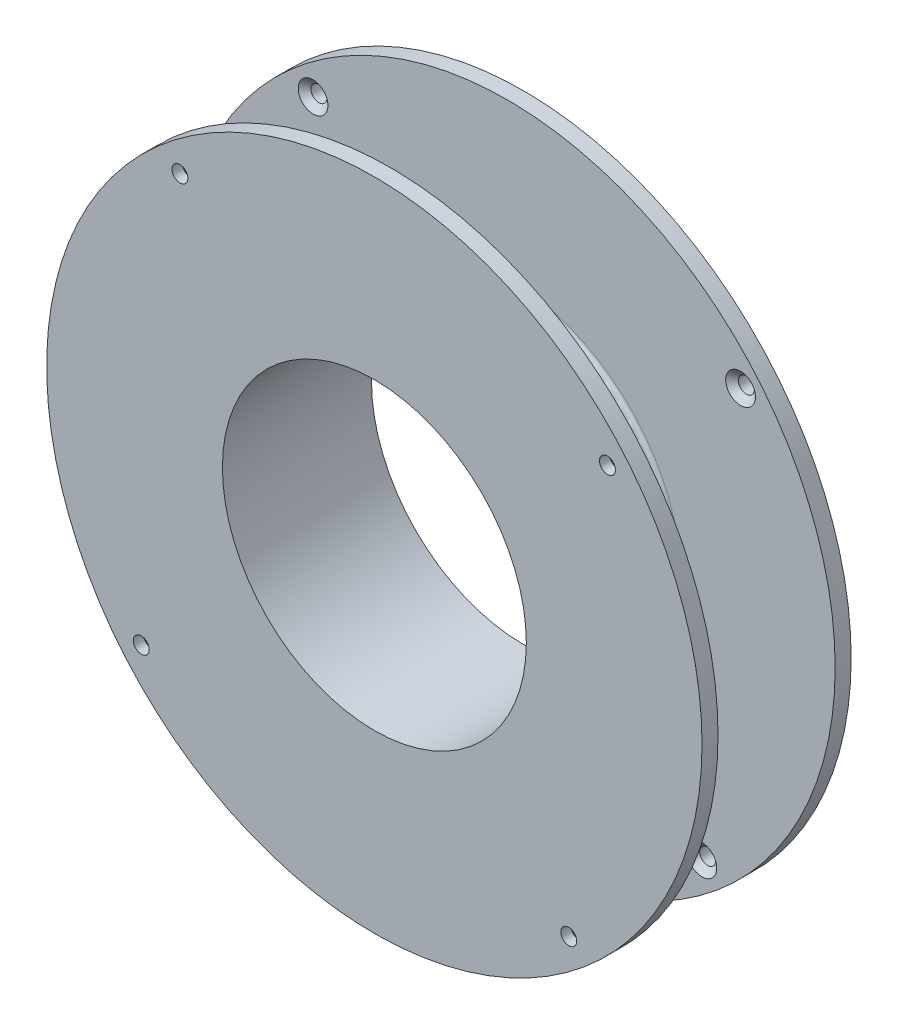
ISO-10303-21;
HEADER;
FILE_DESCRIPTION(('STEP AP214'),'2;1');
FILE_NAME('part.step','',(''),(''),'','','');
FILE_SCHEMA(('AUTOMOTIVE_DESIGN { 1 0 10303 214 1 1 1 1 }'));
ENDSEC;
DATA;
#1=APPLICATION_CONTEXT('core data for automotive mechanical design processes');
#2=APPLICATION_PROTOCOL_DEFINITION('international standard','automotive_design',2000,#1);
#3=PRODUCT_CONTEXT('',#1,'mechanical');
#4=PRODUCT('Part','Part','',(#3));
#5=PRODUCT_RELATED_PRODUCT_CATEGORY('part','',(#4));
#6=PRODUCT_DEFINITION_FORMATION('','',#4);
#7=PRODUCT_DEFINITION_CONTEXT('part definition',#1,'design');
#8=PRODUCT_DEFINITION('design','',#6,#7);
#9=PRODUCT_DEFINITION_SHAPE('','',#8);
#10=(LENGTH_UNIT() NAMED_UNIT(*) SI_UNIT(.MILLI.,.METRE.));
#11=(NAMED_UNIT(*) PLANE_ANGLE_UNIT() SI_UNIT($,.RADIAN.));
#12=(NAMED_UNIT(*) SI_UNIT($,.STERADIAN.) SOLID_ANGLE_UNIT());
#13=UNCERTAINTY_MEASURE_WITH_UNIT(LENGTH_MEASURE(1.E-05),#10,'distance_accuracy_value','');
#14=(GEOMETRIC_REPRESENTATION_CONTEXT(3) GLOBAL_UNCERTAINTY_ASSIGNED_CONTEXT((#13)) GLOBAL_UNIT_ASSIGNED_CONTEXT((#10,
#11,#12)) REPRESENTATION_CONTEXT('',''));
#15=CARTESIAN_POINT('',(0.,0.,0.));
#16=DIRECTION('',(0.,0.,1.));
#17=DIRECTION('',(1.,0.,0.));
#18=AXIS2_PLACEMENT_3D('',#15,#16,#17);
#19=CARTESIAN_POINT('',(35.2425,0.,32.4499999999989));
#20=DIRECTION('',(0.,0.,1.));
#21=DIRECTION('',(1.,0.,0.));
#22=AXIS2_PLACEMENT_3D('',#19,#20,#21);
#23=CYLINDRICAL_SURFACE('',#22,36.2425);
#24=CARTESIAN_POINT('',(35.2425,0.,-4.05999987200111));
#25=DIRECTION('',(0.,0.,1.));
#26=DIRECTION('',(1.,0.,0.));
#27=AXIS2_PLACEMENT_3D('',#24,#25,#26);
#28=CIRCLE('',#27,36.2425);
#29=CARTESIAN_POINT('',(71.485,0.,-4.05999987200111));
#30=VERTEX_POINT('',#29);
#31=EDGE_CURVE('E10',#30,#30,#28,.T.);
#32=ORIENTED_EDGE('',*,*,#31,.F.);
#33=EDGE_LOOP('',(#32));
#34=FACE_BOUND('',#33,.T.);
#35=CARTESIAN_POINT('',(35.2425,0.,31.5000001279989));
#36=DIRECTION('',(0.,0.,1.));
#37=DIRECTION('',(1.,0.,0.));
#38=AXIS2_PLACEMENT_3D('',#35,#36,#37);
#39=CIRCLE('',#38,36.2425);
#40=CARTESIAN_POINT('',(71.485,0.,31.5000001279989));
#41=VERTEX_POINT('',#40);
#42=EDGE_CURVE('E73',#41,#41,#39,.T.);
#43=ORIENTED_EDGE('',*,*,#42,.T.);
#44=EDGE_LOOP('',(#43));
#45=FACE_BOUND('',#44,.T.);
#46=ADVANCED_FACE('F39',(#34,#45),#23,.F.);
#47=CARTESIAN_POINT('',(-42.91,0.,-4.05999987200111));
#48=DIRECTION('',(0.,0.,1.));
#49=DIRECTION('',(1.,0.,0.));
#50=AXIS2_PLACEMENT_3D('',#47,#48,#49);
#51=PLANE('',#50);
#52=CARTESIAN_POINT('',(-11.1223178836377,55.5933068149135,-4.05999987200111));
#53=DIRECTION('',(0.,0.,1.));
#54=DIRECTION('',(1.,0.,0.));
#55=AXIS2_PLACEMENT_3D('',#52,#53,#54);
#56=CIRCLE('',#55,1.89865);
#57=CARTESIAN_POINT('',(-9.22366788363773,55.5933068149135,-4.05999987200111));
#58=VERTEX_POINT('',#57);
#59=EDGE_CURVE('E139',#58,#58,#56,.T.);
#60=ORIENTED_EDGE('',*,*,#59,.T.);
#61=EDGE_LOOP('',(#60));
#62=FACE_BOUND('',#61,.T.);
#63=CARTESIAN_POINT('',(-20.350806814914,-46.3648178836371,-4.05999987200111));
#64=DIRECTION('',(0.,0.,1.));
#65=DIRECTION('',(1.,0.,0.));
#66=AXIS2_PLACEMENT_3D('',#63,#64,#65);
#67=CIRCLE('',#66,1.89865);
#68=CARTESIAN_POINT('',(-18.452156814914,-46.3648178836371,-4.05999987200111));
#69=VERTEX_POINT('',#68);
#70=EDGE_CURVE('E130',#69,#69,#67,.T.);
#71=ORIENTED_EDGE('',*,*,#70,.T.);
#72=EDGE_LOOP('',(#71));
#73=FACE_BOUND('',#72,.T.);
#74=CARTESIAN_POINT('',(81.6073178836377,-55.5933068149135,-4.05999987200111));
#75=DIRECTION('',(0.,0.,1.));
#76=DIRECTION('',(1.,0.,0.));
#77=AXIS2_PLACEMENT_3D('',#74,#75,#76);
#78=CIRCLE('',#77,1.89865);
#79=CARTESIAN_POINT('',(83.5059678836377,-55.5933068149135,-4.05999987200111));
#80=VERTEX_POINT('',#79);
#81=EDGE_CURVE('E121',#80,#80,#78,.T.);
#82=ORIENTED_EDGE('',*,*,#81,.T.);
#83=EDGE_LOOP('',(#82));
#84=FACE_BOUND('',#83,.T.);
#85=CARTESIAN_POINT('',(90.8358068149136,46.3648178836375,-4.05999987200111));
#86=DIRECTION('',(0.,0.,1.));
#87=DIRECTION('',(1.,0.,0.));
#88=AXIS2_PLACEMENT_3D('',#85,#86,#87);
#89=CIRCLE('',#88,1.89865);
#90=CARTESIAN_POINT('',(92.7344568149136,46.3648178836375,-4.05999987200111));
#91=VERTEX_POINT('',#90);
#92=EDGE_CURVE('E112',#91,#91,#89,.T.);
#93=ORIENTED_EDGE('',*,*,#92,.T.);
#94=EDGE_LOOP('',(#93));
#95=FACE_BOUND('',#94,.T.);
#96=CARTESIAN_POINT('',(35.2425,0.,-4.05999987200111));
#97=DIRECTION('',(0.,0.,1.));
#98=DIRECTION('',(1.,0.,0.));
#99=AXIS2_PLACEMENT_3D('',#96,#97,#98);
#100=CIRCLE('',#99,78.1525);
#101=CARTESIAN_POINT('',(113.395,0.,-4.05999987200111));
#102=VERTEX_POINT('',#101);
#103=EDGE_CURVE('E45',#102,#102,#100,.T.);
#104=ORIENTED_EDGE('',*,*,#103,.F.);
#105=EDGE_LOOP('',(#104));
#106=FACE_BOUND('',#105,.T.);
#107=ORIENTED_EDGE('',*,*,#31,.T.);
#108=EDGE_LOOP('',(#107));
#109=FACE_BOUND('',#108,.T.);
#110=ADVANCED_FACE('F168',(#62,#73,#84,#95,#106,#109),#51,.F.);
#111=CARTESIAN_POINT('',(35.2425,0.,32.4499999999989));
#112=DIRECTION('',(0.,0.,1.));
#113=DIRECTION('',(1.,0.,0.));
#114=AXIS2_PLACEMENT_3D('',#111,#112,#113);
#115=CYLINDRICAL_SURFACE('',#114,78.1525);
#116=CARTESIAN_POINT('',(35.2425,0.,-0.249999872001111));
#117=DIRECTION('',(0.,0.,1.));
#118=DIRECTION('',(1.,0.,0.));
#119=AXIS2_PLACEMENT_3D('',#116,#117,#118);
#120=CIRCLE('',#119,78.1525);
#121=CARTESIAN_POINT('',(113.395,0.,-0.249999872001111));
#122=VERTEX_POINT('',#121);
#123=EDGE_CURVE('E49',#122,#122,#120,.T.);
#124=ORIENTED_EDGE('',*,*,#123,.F.);
#125=EDGE_LOOP('',(#124));
#126=FACE_BOUND('',#125,.T.);
#127=ORIENTED_EDGE('',*,*,#103,.T.);
#128=EDGE_LOOP('',(#127));
#129=FACE_BOUND('',#128,.T.);
#130=ADVANCED_FACE('F155',(#126,#129),#115,.T.);
#131=CARTESIAN_POINT('',(-42.91,0.,-0.249999872001114));
#132=DIRECTION('',(0.,0.,-1.));
#133=DIRECTION('',(-1.,0.,0.));
#134=AXIS2_PLACEMENT_3D('',#131,#132,#133);
#135=PLANE('',#134);
#136=CARTESIAN_POINT('',(-11.1223178836377,55.5933068149135,-0.249999872001111));
#137=DIRECTION('',(0.,0.,1.));
#138=DIRECTION('',(1.,0.,0.));
#139=AXIS2_PLACEMENT_3D('',#136,#137,#138);
#140=CIRCLE('',#139,3.5433);
#141=CARTESIAN_POINT('',(-7.57901788363773,55.5933068149135,-0.249999872001111));
#142=VERTEX_POINT('',#141);
#143=EDGE_CURVE('E145',#142,#142,#140,.T.);
#144=ORIENTED_EDGE('',*,*,#143,.F.);
#145=EDGE_LOOP('',(#144));
#146=FACE_BOUND('',#145,.T.);
#147=CARTESIAN_POINT('',(-20.350806814914,-46.3648178836371,-0.249999872001111));
#148=DIRECTION('',(0.,0.,1.));
#149=DIRECTION('',(1.,0.,0.));
#150=AXIS2_PLACEMENT_3D('',#147,#148,#149);
#151=CIRCLE('',#150,3.5433);
#152=CARTESIAN_POINT('',(-16.807506814914,-46.3648178836371,-0.249999872001111));
#153=VERTEX_POINT('',#152);
#154=EDGE_CURVE('E136',#153,#153,#151,.T.);
#155=ORIENTED_EDGE('',*,*,#154,.F.);
#156=EDGE_LOOP('',(#155));
#157=FACE_BOUND('',#156,.T.);
#158=CARTESIAN_POINT('',(81.6073178836377,-55.5933068149135,-0.249999872001111));
#159=DIRECTION('',(0.,0.,1.));
#160=DIRECTION('',(1.,0.,0.));
#161=AXIS2_PLACEMENT_3D('',#158,#159,#160);
#162=CIRCLE('',#161,3.5433);
#163=CARTESIAN_POINT('',(85.1506178836377,-55.5933068149135,-0.249999872001111));
#164=VERTEX_POINT('',#163);
#165=EDGE_CURVE('E127',#164,#164,#162,.T.);
#166=ORIENTED_EDGE('',*,*,#165,.F.);
#167=EDGE_LOOP('',(#166));
#168=FACE_BOUND('',#167,.T.);
#169=CARTESIAN_POINT('',(90.8358068149136,46.3648178836375,-0.249999872001111));
#170=DIRECTION('',(0.,0.,1.));
#171=DIRECTION('',(1.,0.,0.));
#172=AXIS2_PLACEMENT_3D('',#169,#170,#171);
#173=CIRCLE('',#172,3.5433);
#174=CARTESIAN_POINT('',(94.3791068149136,46.3648178836375,-0.249999872001111));
#175=VERTEX_POINT('',#174);
#176=EDGE_CURVE('E118',#175,#175,#173,.T.);
#177=ORIENTED_EDGE('',*,*,#176,.F.);
#178=EDGE_LOOP('',(#177));
#179=FACE_BOUND('',#178,.T.);
#180=CARTESIAN_POINT('',(35.2425,0.,-0.249999872001111));
#181=DIRECTION('',(0.,0.,1.));
#182=DIRECTION('',(1.,0.,0.));
#183=AXIS2_PLACEMENT_3D('',#180,#181,#182);
#184=CIRCLE('',#183,41.3225);
#185=CARTESIAN_POINT('',(76.565,0.,-0.249999872001111));
#186=VERTEX_POINT('',#185);
#187=EDGE_CURVE('E53',#186,#186,#184,.T.);
#188=ORIENTED_EDGE('',*,*,#187,.F.);
#189=EDGE_LOOP('',(#188));
#190=FACE_BOUND('',#189,.T.);
#191=ORIENTED_EDGE('',*,*,#123,.T.);
#192=EDGE_LOOP('',(#191));
#193=FACE_BOUND('',#192,.T.);
#194=ADVANCED_FACE('F151',(#146,#157,#168,#179,#190,#193),#135,.F.);
#195=CARTESIAN_POINT('',(35.2425,0.,1.02000012799889));
#196=DIRECTION('',(0.,0.,1.));
#197=DIRECTION('',(1.,0.,0.));
#198=AXIS2_PLACEMENT_3D('',#195,#196,#197);
#199=TOROIDAL_SURFACE('',#198,41.3225,1.27);
#200=CARTESIAN_POINT('',(35.2425,0.,1.02000012799888));
#201=DIRECTION('',(0.,0.,1.));
#202=DIRECTION('',(1.,0.,0.));
#203=AXIS2_PLACEMENT_3D('',#200,#201,#202);
#204=CIRCLE('',#203,40.0525);
#205=CARTESIAN_POINT('',(75.295,0.,1.02000012799888));
#206=VERTEX_POINT('',#205);
#207=EDGE_CURVE('E58',#206,#206,#204,.T.);
#208=ORIENTED_EDGE('',*,*,#207,.F.);
#209=EDGE_LOOP('',(#208));
#210=FACE_BOUND('',#209,.T.);
#211=ORIENTED_EDGE('',*,*,#187,.T.);
#212=EDGE_LOOP('',(#211));
#213=FACE_BOUND('',#212,.T.);
#214=ADVANCED_FACE('F154',(#210,#213),#199,.F.);
#215=CARTESIAN_POINT('',(35.2425,0.,32.4499999999989));
#216=DIRECTION('',(0.,0.,1.));
#217=DIRECTION('',(1.,0.,0.));
#218=AXIS2_PLACEMENT_3D('',#215,#216,#217);
#219=CYLINDRICAL_SURFACE('',#218,40.0525);
#220=CARTESIAN_POINT('',(35.2425,0.,26.4200001279989));
#221=DIRECTION('',(0.,0.,1.));
#222=DIRECTION('',(1.,0.,0.));
#223=AXIS2_PLACEMENT_3D('',#220,#221,#222);
#224=CIRCLE('',#223,40.0525);
#225=CARTESIAN_POINT('',(75.295,0.,26.4200001279989));
#226=VERTEX_POINT('',#225);
#227=EDGE_CURVE('E61',#226,#226,#224,.T.);
#228=ORIENTED_EDGE('',*,*,#227,.F.);
#229=EDGE_LOOP('',(#228));
#230=FACE_BOUND('',#229,.T.);
#231=ORIENTED_EDGE('',*,*,#207,.T.);
#232=EDGE_LOOP('',(#231));
#233=FACE_BOUND('',#232,.T.);
#234=ADVANCED_FACE('F206',(#230,#233),#219,.T.);
#235=CARTESIAN_POINT('',(35.2425,0.,26.4200001279989));
#236=DIRECTION('',(0.,0.,1.));
#237=DIRECTION('',(1.,0.,0.));
#238=AXIS2_PLACEMENT_3D('',#235,#236,#237);
#239=TOROIDAL_SURFACE('',#238,41.3225,1.27);
#240=CARTESIAN_POINT('',(35.2425,0.,27.6900001279989));
#241=DIRECTION('',(0.,0.,1.));
#242=DIRECTION('',(1.,0.,0.));
#243=AXIS2_PLACEMENT_3D('',#240,#241,#242);
#244=CIRCLE('',#243,41.3225);
#245=CARTESIAN_POINT('',(76.565,0.,27.6900001279989));
#246=VERTEX_POINT('',#245);
#247=EDGE_CURVE('E64',#246,#246,#244,.T.);
#248=ORIENTED_EDGE('',*,*,#247,.F.);
#249=EDGE_LOOP('',(#248));
#250=FACE_BOUND('',#249,.T.);
#251=ORIENTED_EDGE('',*,*,#227,.T.);
#252=EDGE_LOOP('',(#251));
#253=FACE_BOUND('',#252,.T.);
#254=ADVANCED_FACE('F199',(#250,#253),#239,.F.);
#255=CARTESIAN_POINT('',(-42.91,0.,27.6900001279989));
#256=DIRECTION('',(0.,0.,1.));
#257=DIRECTION('',(1.,0.,0.));
#258=AXIS2_PLACEMENT_3D('',#255,#256,#257);
#259=PLANE('',#258);
#260=CARTESIAN_POINT('',(90.8358068149136,46.3648178836375,27.6900001279989));
#261=DIRECTION('',(0.,0.,-1.));
#262=DIRECTION('',(-1.,0.,0.));
#263=AXIS2_PLACEMENT_3D('',#260,#261,#262);
#264=CIRCLE('',#263,3.5433);
#265=CARTESIAN_POINT('',(87.2925068149136,46.3648178836375,27.6900001279989));
#266=VERTEX_POINT('',#265);
#267=EDGE_CURVE('E109',#266,#266,#264,.T.);
#268=ORIENTED_EDGE('',*,*,#267,.F.);
#269=EDGE_LOOP('',(#268));
#270=FACE_BOUND('',#269,.T.);
#271=CARTESIAN_POINT('',(81.6073178836377,-55.5933068149135,27.6900001279989));
#272=DIRECTION('',(0.,0.,-1.));
#273=DIRECTION('',(-1.,0.,0.));
#274=AXIS2_PLACEMENT_3D('',#271,#272,#273);
#275=CIRCLE('',#274,3.5433);
#276=CARTESIAN_POINT('',(78.0640178836377,-55.5933068149135,27.6900001279989));
#277=VERTEX_POINT('',#276);
#278=EDGE_CURVE('E100',#277,#277,#275,.T.);
#279=ORIENTED_EDGE('',*,*,#278,.F.);
#280=EDGE_LOOP('',(#279));
#281=FACE_BOUND('',#280,.T.);
#282=CARTESIAN_POINT('',(-20.350806814914,-46.3648178836371,27.6900001279989));
#283=DIRECTION('',(0.,0.,-1.));
#284=DIRECTION('',(-1.,0.,0.));
#285=AXIS2_PLACEMENT_3D('',#282,#283,#284);
#286=CIRCLE('',#285,3.5433);
#287=CARTESIAN_POINT('',(-23.894106814914,-46.3648178836371,27.6900001279989));
#288=VERTEX_POINT('',#287);
#289=EDGE_CURVE('E91',#288,#288,#286,.T.);
#290=ORIENTED_EDGE('',*,*,#289,.F.);
#291=EDGE_LOOP('',(#290));
#292=FACE_BOUND('',#291,.T.);
#293=CARTESIAN_POINT('',(-11.1223178836377,55.5933068149135,27.6900001279989));
#294=DIRECTION('',(0.,0.,-1.));
#295=DIRECTION('',(-1.,0.,0.));
#296=AXIS2_PLACEMENT_3D('',#293,#294,#295);
#297=CIRCLE('',#296,3.5433);
#298=CARTESIAN_POINT('',(-14.6656178836377,55.5933068149135,27.6900001279989));
#299=VERTEX_POINT('',#298);
#300=EDGE_CURVE('E82',#299,#299,#297,.T.);
#301=ORIENTED_EDGE('',*,*,#300,.F.);
#302=EDGE_LOOP('',(#301));
#303=FACE_BOUND('',#302,.T.);
#304=CARTESIAN_POINT('',(35.2425,0.,27.6900001279989));
#305=DIRECTION('',(0.,0.,1.));
#306=DIRECTION('',(1.,0.,0.));
#307=AXIS2_PLACEMENT_3D('',#304,#305,#306);
#308=CIRCLE('',#307,78.1525);
#309=CARTESIAN_POINT('',(113.395,0.,27.6900001279989));
#310=VERTEX_POINT('',#309);
#311=EDGE_CURVE('E67',#310,#310,#308,.T.);
#312=ORIENTED_EDGE('',*,*,#311,.F.);
#313=EDGE_LOOP('',(#312));
#314=FACE_BOUND('',#313,.T.);
#315=ORIENTED_EDGE('',*,*,#247,.T.);
#316=EDGE_LOOP('',(#315));
#317=FACE_BOUND('',#316,.T.);
#318=ADVANCED_FACE('F193',(#270,#281,#292,#303,#314,#317),#259,.F.);
#319=CARTESIAN_POINT('',(35.2425,0.,32.4499999999989));
#320=DIRECTION('',(0.,0.,1.));
#321=DIRECTION('',(1.,0.,0.));
#322=AXIS2_PLACEMENT_3D('',#319,#320,#321);
#323=CYLINDRICAL_SURFACE('',#322,78.1525);
#324=CARTESIAN_POINT('',(35.2425,0.,31.5000001279989));
#325=DIRECTION('',(0.,0.,1.));
#326=DIRECTION('',(1.,0.,0.));
#327=AXIS2_PLACEMENT_3D('',#324,#325,#326);
#328=CIRCLE('',#327,78.1525);
#329=CARTESIAN_POINT('',(113.395,0.,31.5000001279989));
#330=VERTEX_POINT('',#329);
#331=EDGE_CURVE('E70',#330,#330,#328,.T.);
#332=ORIENTED_EDGE('',*,*,#331,.F.);
#333=EDGE_LOOP('',(#332));
#334=FACE_BOUND('',#333,.T.);
#335=ORIENTED_EDGE('',*,*,#311,.T.);
#336=EDGE_LOOP('',(#335));
#337=FACE_BOUND('',#336,.T.);
#338=ADVANCED_FACE('F186',(#334,#337),#323,.T.);
#339=CARTESIAN_POINT('',(-1.00000000000005,0.,31.5000001279989));
#340=DIRECTION('',(0.,0.,-1.));
#341=DIRECTION('',(-1.,0.,0.));
#342=AXIS2_PLACEMENT_3D('',#339,#340,#341);
#343=PLANE('',#342);
#344=CARTESIAN_POINT('',(90.8358068149136,46.3648178836375,31.5000001279989));
#345=DIRECTION('',(0.,0.,-1.));
#346=DIRECTION('',(-1.,0.,0.));
#347=AXIS2_PLACEMENT_3D('',#344,#345,#346);
#348=CIRCLE('',#347,1.89865);
#349=CARTESIAN_POINT('',(88.9371568149136,46.3648178836375,31.5000001279989));
#350=VERTEX_POINT('',#349);
#351=EDGE_CURVE('E103',#350,#350,#348,.T.);
#352=ORIENTED_EDGE('',*,*,#351,.T.);
#353=EDGE_LOOP('',(#352));
#354=FACE_BOUND('',#353,.T.);
#355=CARTESIAN_POINT('',(81.6073178836377,-55.5933068149135,31.5000001279989));
#356=DIRECTION('',(0.,0.,-1.));
#357=DIRECTION('',(-1.,0.,0.));
#358=AXIS2_PLACEMENT_3D('',#355,#356,#357);
#359=CIRCLE('',#358,1.89865);
#360=CARTESIAN_POINT('',(79.7086678836377,-55.5933068149135,31.5000001279989));
#361=VERTEX_POINT('',#360);
#362=EDGE_CURVE('E94',#361,#361,#359,.T.);
#363=ORIENTED_EDGE('',*,*,#362,.T.);
#364=EDGE_LOOP('',(#363));
#365=FACE_BOUND('',#364,.T.);
#366=CARTESIAN_POINT('',(-20.350806814914,-46.3648178836371,31.5000001279989));
#367=DIRECTION('',(0.,0.,-1.));
#368=DIRECTION('',(-1.,0.,0.));
#369=AXIS2_PLACEMENT_3D('',#366,#367,#368);
#370=CIRCLE('',#369,1.89865);
#371=CARTESIAN_POINT('',(-22.249456814914,-46.3648178836371,31.5000001279989));
#372=VERTEX_POINT('',#371);
#373=EDGE_CURVE('E85',#372,#372,#370,.T.);
#374=ORIENTED_EDGE('',*,*,#373,.T.);
#375=EDGE_LOOP('',(#374));
#376=FACE_BOUND('',#375,.T.);
#377=CARTESIAN_POINT('',(-11.1223178836377,55.5933068149135,31.5000001279989));
#378=DIRECTION('',(0.,0.,-1.));
#379=DIRECTION('',(-1.,0.,0.));
#380=AXIS2_PLACEMENT_3D('',#377,#378,#379);
#381=CIRCLE('',#380,1.89865);
#382=CARTESIAN_POINT('',(-13.0209678836377,55.5933068149135,31.5000001279989));
#383=VERTEX_POINT('',#382);
#384=EDGE_CURVE('E76',#383,#383,#381,.T.);
#385=ORIENTED_EDGE('',*,*,#384,.T.);
#386=EDGE_LOOP('',(#385));
#387=FACE_BOUND('',#386,.T.);
#388=ORIENTED_EDGE('',*,*,#42,.F.);
#389=EDGE_LOOP('',(#388));
#390=FACE_BOUND('',#389,.T.);
#391=ORIENTED_EDGE('',*,*,#331,.T.);
#392=EDGE_LOOP('',(#391));
#393=FACE_BOUND('',#392,.T.);
#394=ADVANCED_FACE('F182',(#354,#365,#376,#387,#390,#393),#343,.F.);
#395=CARTESIAN_POINT('',(-11.1223178836377,55.5933068149135,27.6900001279989));
#396=DIRECTION('',(0.,0.,-1.));
#397=DIRECTION('',(-1.,0.,0.));
#398=AXIS2_PLACEMENT_3D('',#395,#396,#397);
#399=CYLINDRICAL_SURFACE('',#398,1.89865);
#400=ORIENTED_EDGE('',*,*,#384,.F.);
#401=EDGE_LOOP('',(#400));
#402=FACE_BOUND('',#401,.T.);
#403=CARTESIAN_POINT('',(-11.1223178836377,55.5933068149135,29.0700253364146));
#404=DIRECTION('',(0.,0.,-1.));
#405=DIRECTION('',(-1.,0.,0.));
#406=AXIS2_PLACEMENT_3D('',#403,#404,#405);
#407=CIRCLE('',#406,1.89865);
#408=CARTESIAN_POINT('',(-13.0209678836377,55.5933068149135,29.0700253364146));
#409=VERTEX_POINT('',#408);
#410=EDGE_CURVE('E79',#409,#409,#407,.T.);
#411=ORIENTED_EDGE('',*,*,#410,.T.);
#412=EDGE_LOOP('',(#411));
#413=FACE_BOUND('',#412,.T.);
#414=ADVANCED_FACE('F185',(#402,#413),#399,.F.);
#415=CARTESIAN_POINT('',(-11.1223178836377,55.5933068149135,27.6900001279989));
#416=DIRECTION('',(0.,0.,-1.));
#417=DIRECTION('',(-1.,0.,0.));
#418=AXIS2_PLACEMENT_3D('',#415,#416,#417);
#419=CONICAL_SURFACE('',#418,3.5433,0.872664625997165);
#420=ORIENTED_EDGE('',*,*,#410,.F.);
#421=EDGE_LOOP('',(#420));
#422=FACE_BOUND('',#421,.T.);
#423=ORIENTED_EDGE('',*,*,#300,.T.);
#424=EDGE_LOOP('',(#423));
#425=FACE_BOUND('',#424,.T.);
#426=ADVANCED_FACE('F222',(#422,#425),#419,.F.);
#427=CARTESIAN_POINT('',(-20.350806814914,-46.3648178836371,27.6900001279989));
#428=DIRECTION('',(0.,0.,-1.));
#429=DIRECTION('',(-1.,0.,0.));
#430=AXIS2_PLACEMENT_3D('',#427,#428,#429);
#431=CYLINDRICAL_SURFACE('',#430,1.89865);
#432=ORIENTED_EDGE('',*,*,#373,.F.);
#433=EDGE_LOOP('',(#432));
#434=FACE_BOUND('',#433,.T.);
#435=CARTESIAN_POINT('',(-20.350806814914,-46.3648178836371,29.0700253364146));
#436=DIRECTION('',(0.,0.,-1.));
#437=DIRECTION('',(-1.,0.,0.));
#438=AXIS2_PLACEMENT_3D('',#435,#436,#437);
#439=CIRCLE('',#438,1.89865);
#440=CARTESIAN_POINT('',(-22.249456814914,-46.3648178836371,29.0700253364146));
#441=VERTEX_POINT('',#440);
#442=EDGE_CURVE('E88',#441,#441,#439,.T.);
#443=ORIENTED_EDGE('',*,*,#442,.T.);
#444=EDGE_LOOP('',(#443));
#445=FACE_BOUND('',#444,.T.);
#446=ADVANCED_FACE('F226',(#434,#445),#431,.F.);
#447=CARTESIAN_POINT('',(-20.350806814914,-46.3648178836371,27.6900001279989));
#448=DIRECTION('',(0.,0.,-1.));
#449=DIRECTION('',(-1.,0.,0.));
#450=AXIS2_PLACEMENT_3D('',#447,#448,#449);
#451=CONICAL_SURFACE('',#450,3.5433,0.872664625997164);
#452=ORIENTED_EDGE('',*,*,#442,.F.);
#453=EDGE_LOOP('',(#452));
#454=FACE_BOUND('',#453,.T.);
#455=ORIENTED_EDGE('',*,*,#289,.T.);
#456=EDGE_LOOP('',(#455));
#457=FACE_BOUND('',#456,.T.);
#458=ADVANCED_FACE('F230',(#454,#457),#451,.F.);
#459=CARTESIAN_POINT('',(81.6073178836377,-55.5933068149135,27.6900001279989));
#460=DIRECTION('',(0.,0.,-1.));
#461=DIRECTION('',(-1.,0.,0.));
#462=AXIS2_PLACEMENT_3D('',#459,#460,#461);
#463=CYLINDRICAL_SURFACE('',#462,1.89865);
#464=ORIENTED_EDGE('',*,*,#362,.F.);
#465=EDGE_LOOP('',(#464));
#466=FACE_BOUND('',#465,.T.);
#467=CARTESIAN_POINT('',(81.6073178836377,-55.5933068149135,29.0700253364146));
#468=DIRECTION('',(0.,0.,-1.));
#469=DIRECTION('',(-1.,0.,0.));
#470=AXIS2_PLACEMENT_3D('',#467,#468,#469);
#471=CIRCLE('',#470,1.89865);
#472=CARTESIAN_POINT('',(79.7086678836377,-55.5933068149135,29.0700253364146));
#473=VERTEX_POINT('',#472);
#474=EDGE_CURVE('E97',#473,#473,#471,.T.);
#475=ORIENTED_EDGE('',*,*,#474,.T.);
#476=EDGE_LOOP('',(#475));
#477=FACE_BOUND('',#476,.T.);
#478=ADVANCED_FACE('F234',(#466,#477),#463,.F.);
#479=CARTESIAN_POINT('',(81.6073178836377,-55.5933068149135,27.6900001279989));
#480=DIRECTION('',(0.,0.,-1.));
#481=DIRECTION('',(-1.,0.,0.));
#482=AXIS2_PLACEMENT_3D('',#479,#480,#481);
#483=CONICAL_SURFACE('',#482,3.5433,0.872664625997163);
#484=ORIENTED_EDGE('',*,*,#474,.F.);
#485=EDGE_LOOP('',(#484));
#486=FACE_BOUND('',#485,.T.);
#487=ORIENTED_EDGE('',*,*,#278,.T.);
#488=EDGE_LOOP('',(#487));
#489=FACE_BOUND('',#488,.T.);
#490=ADVANCED_FACE('F238',(#486,#489),#483,.F.);
#491=CARTESIAN_POINT('',(90.8358068149136,46.3648178836375,27.6900001279989));
#492=DIRECTION('',(0.,0.,-1.));
#493=DIRECTION('',(-1.,0.,0.));
#494=AXIS2_PLACEMENT_3D('',#491,#492,#493);
#495=CYLINDRICAL_SURFACE('',#494,1.89865);
#496=ORIENTED_EDGE('',*,*,#351,.F.);
#497=EDGE_LOOP('',(#496));
#498=FACE_BOUND('',#497,.T.);
#499=CARTESIAN_POINT('',(90.8358068149136,46.3648178836375,29.0700253364146));
#500=DIRECTION('',(0.,0.,-1.));
#501=DIRECTION('',(-1.,0.,0.));
#502=AXIS2_PLACEMENT_3D('',#499,#500,#501);
#503=CIRCLE('',#502,1.89865);
#504=CARTESIAN_POINT('',(88.9371568149136,46.3648178836375,29.0700253364146));
#505=VERTEX_POINT('',#504);
#506=EDGE_CURVE('E106',#505,#505,#503,.T.);
#507=ORIENTED_EDGE('',*,*,#506,.T.);
#508=EDGE_LOOP('',(#507));
#509=FACE_BOUND('',#508,.T.);
#510=ADVANCED_FACE('F242',(#498,#509),#495,.F.);
#511=CARTESIAN_POINT('',(90.8358068149136,46.3648178836375,27.6900001279989));
#512=DIRECTION('',(0.,0.,-1.));
#513=DIRECTION('',(-1.,0.,0.));
#514=AXIS2_PLACEMENT_3D('',#511,#512,#513);
#515=CONICAL_SURFACE('',#514,3.5433,0.872664625997163);
#516=ORIENTED_EDGE('',*,*,#506,.F.);
#517=EDGE_LOOP('',(#516));
#518=FACE_BOUND('',#517,.T.);
#519=ORIENTED_EDGE('',*,*,#267,.T.);
#520=EDGE_LOOP('',(#519));
#521=FACE_BOUND('',#520,.T.);
#522=ADVANCED_FACE('F246',(#518,#521),#515,.F.);
#523=CARTESIAN_POINT('',(90.8358068149136,46.3648178836375,-0.249999872001111));
#524=DIRECTION('',(0.,0.,1.));
#525=DIRECTION('',(1.,0.,0.));
#526=AXIS2_PLACEMENT_3D('',#523,#524,#525);
#527=CYLINDRICAL_SURFACE('',#526,1.89865);
#528=ORIENTED_EDGE('',*,*,#92,.F.);
#529=EDGE_LOOP('',(#528));
#530=FACE_BOUND('',#529,.T.);
#531=CARTESIAN_POINT('',(90.8358068149136,46.3648178836375,-1.63002508041682));
#532=DIRECTION('',(0.,0.,1.));
#533=DIRECTION('',(1.,0.,0.));
#534=AXIS2_PLACEMENT_3D('',#531,#532,#533);
#535=CIRCLE('',#534,1.89865);
#536=CARTESIAN_POINT('',(92.7344568149136,46.3648178836375,-1.63002508041682));
#537=VERTEX_POINT('',#536);
#538=EDGE_CURVE('E115',#537,#537,#535,.T.);
#539=ORIENTED_EDGE('',*,*,#538,.T.);
#540=EDGE_LOOP('',(#539));
#541=FACE_BOUND('',#540,.T.);
#542=ADVANCED_FACE('F250',(#530,#541),#527,.F.);
#543=CARTESIAN_POINT('',(90.8358068149136,46.3648178836375,-0.249999872001111));
#544=DIRECTION('',(0.,0.,1.));
#545=DIRECTION('',(1.,0.,0.));
#546=AXIS2_PLACEMENT_3D('',#543,#544,#545);
#547=CONICAL_SURFACE('',#546,3.5433,0.872664625997164);
#548=ORIENTED_EDGE('',*,*,#538,.F.);
#549=EDGE_LOOP('',(#548));
#550=FACE_BOUND('',#549,.T.);
#551=ORIENTED_EDGE('',*,*,#176,.T.);
#552=EDGE_LOOP('',(#551));
#553=FACE_BOUND('',#552,.T.);
#554=ADVANCED_FACE('F254',(#550,#553),#547,.F.);
#555=CARTESIAN_POINT('',(81.6073178836377,-55.5933068149135,-0.249999872001111));
#556=DIRECTION('',(0.,0.,1.));
#557=DIRECTION('',(1.,0.,0.));
#558=AXIS2_PLACEMENT_3D('',#555,#556,#557);
#559=CYLINDRICAL_SURFACE('',#558,1.89865);
#560=ORIENTED_EDGE('',*,*,#81,.F.);
#561=EDGE_LOOP('',(#560));
#562=FACE_BOUND('',#561,.T.);
#563=CARTESIAN_POINT('',(81.6073178836377,-55.5933068149135,-1.63002508041682));
#564=DIRECTION('',(0.,0.,1.));
#565=DIRECTION('',(1.,0.,0.));
#566=AXIS2_PLACEMENT_3D('',#563,#564,#565);
#567=CIRCLE('',#566,1.89865);
#568=CARTESIAN_POINT('',(83.5059678836377,-55.5933068149135,-1.63002508041682));
#569=VERTEX_POINT('',#568);
#570=EDGE_CURVE('E124',#569,#569,#567,.T.);
#571=ORIENTED_EDGE('',*,*,#570,.T.);
#572=EDGE_LOOP('',(#571));
#573=FACE_BOUND('',#572,.T.);
#574=ADVANCED_FACE('F258',(#562,#573),#559,.F.);
#575=CARTESIAN_POINT('',(81.6073178836377,-55.5933068149135,-0.249999872001111));
#576=DIRECTION('',(0.,0.,1.));
#577=DIRECTION('',(1.,0.,0.));
#578=AXIS2_PLACEMENT_3D('',#575,#576,#577);
#579=CONICAL_SURFACE('',#578,3.5433,0.872664625997164);
#580=ORIENTED_EDGE('',*,*,#570,.F.);
#581=EDGE_LOOP('',(#580));
#582=FACE_BOUND('',#581,.T.);
#583=ORIENTED_EDGE('',*,*,#165,.T.);
#584=EDGE_LOOP('',(#583));
#585=FACE_BOUND('',#584,.T.);
#586=ADVANCED_FACE('F262',(#582,#585),#579,.F.);
#587=CARTESIAN_POINT('',(-20.350806814914,-46.3648178836371,-0.249999872001111));
#588=DIRECTION('',(0.,0.,1.));
#589=DIRECTION('',(1.,0.,0.));
#590=AXIS2_PLACEMENT_3D('',#587,#588,#589);
#591=CYLINDRICAL_SURFACE('',#590,1.89865);
#592=ORIENTED_EDGE('',*,*,#70,.F.);
#593=EDGE_LOOP('',(#592));
#594=FACE_BOUND('',#593,.T.);
#595=CARTESIAN_POINT('',(-20.350806814914,-46.3648178836371,-1.63002508041682));
#596=DIRECTION('',(0.,0.,1.));
#597=DIRECTION('',(1.,0.,0.));
#598=AXIS2_PLACEMENT_3D('',#595,#596,#597);
#599=CIRCLE('',#598,1.89865);
#600=CARTESIAN_POINT('',(-18.452156814914,-46.3648178836371,-1.63002508041682));
#601=VERTEX_POINT('',#600);
#602=EDGE_CURVE('E133',#601,#601,#599,.T.);
#603=ORIENTED_EDGE('',*,*,#602,.T.);
#604=EDGE_LOOP('',(#603));
#605=FACE_BOUND('',#604,.T.);
#606=ADVANCED_FACE('F266',(#594,#605),#591,.F.);
#607=CARTESIAN_POINT('',(-20.350806814914,-46.3648178836371,-0.249999872001111));
#608=DIRECTION('',(0.,0.,1.));
#609=DIRECTION('',(1.,0.,0.));
#610=AXIS2_PLACEMENT_3D('',#607,#608,#609);
#611=CONICAL_SURFACE('',#610,3.5433,0.872664625997165);
#612=ORIENTED_EDGE('',*,*,#602,.F.);
#613=EDGE_LOOP('',(#612));
#614=FACE_BOUND('',#613,.T.);
#615=ORIENTED_EDGE('',*,*,#154,.T.);
#616=EDGE_LOOP('',(#615));
#617=FACE_BOUND('',#616,.T.);
#618=ADVANCED_FACE('F270',(#614,#617),#611,.F.);
#619=CARTESIAN_POINT('',(-11.1223178836377,55.5933068149135,-0.249999872001111));
#620=DIRECTION('',(0.,0.,1.));
#621=DIRECTION('',(1.,0.,0.));
#622=AXIS2_PLACEMENT_3D('',#619,#620,#621);
#623=CYLINDRICAL_SURFACE('',#622,1.89865);
#624=ORIENTED_EDGE('',*,*,#59,.F.);
#625=EDGE_LOOP('',(#624));
#626=FACE_BOUND('',#625,.T.);
#627=CARTESIAN_POINT('',(-11.1223178836377,55.5933068149135,-1.63002508041682));
#628=DIRECTION('',(0.,0.,1.));
#629=DIRECTION('',(1.,0.,0.));
#630=AXIS2_PLACEMENT_3D('',#627,#628,#629);
#631=CIRCLE('',#630,1.89865);
#632=CARTESIAN_POINT('',(-9.22366788363773,55.5933068149135,-1.63002508041682));
#633=VERTEX_POINT('',#632);
#634=EDGE_CURVE('E142',#633,#633,#631,.T.);
#635=ORIENTED_EDGE('',*,*,#634,.T.);
#636=EDGE_LOOP('',(#635));
#637=FACE_BOUND('',#636,.T.);
#638=ADVANCED_FACE('F274',(#626,#637),#623,.F.);
#639=CARTESIAN_POINT('',(-11.1223178836377,55.5933068149135,-0.249999872001111));
#640=DIRECTION('',(0.,0.,1.));
#641=DIRECTION('',(1.,0.,0.));
#642=AXIS2_PLACEMENT_3D('',#639,#640,#641);
#643=CONICAL_SURFACE('',#642,3.5433,0.872664625997165);
#644=ORIENTED_EDGE('',*,*,#634,.F.);
#645=EDGE_LOOP('',(#644));
#646=FACE_BOUND('',#645,.T.);
#647=ORIENTED_EDGE('',*,*,#143,.T.);
#648=EDGE_LOOP('',(#647));
#649=FACE_BOUND('',#648,.T.);
#650=ADVANCED_FACE('F149',(#646,#649),#643,.F.);
#651=CLOSED_SHELL('',(#46,#110,#130,#194,#214,#234,#254,#318,#338,#394,#414,#426,#446,#458,#478,
#490,#510,#522,#542,#554,#574,#586,#606,#618,#638,#650));
#652=MANIFOLD_SOLID_BREP('B2',#651);
#653=ADVANCED_BREP_SHAPE_REPRESENTATION('',(#18,#652),#14);
#654=SHAPE_DEFINITION_REPRESENTATION(#9,#653);
ENDSEC;
END-ISO-10303-21;
